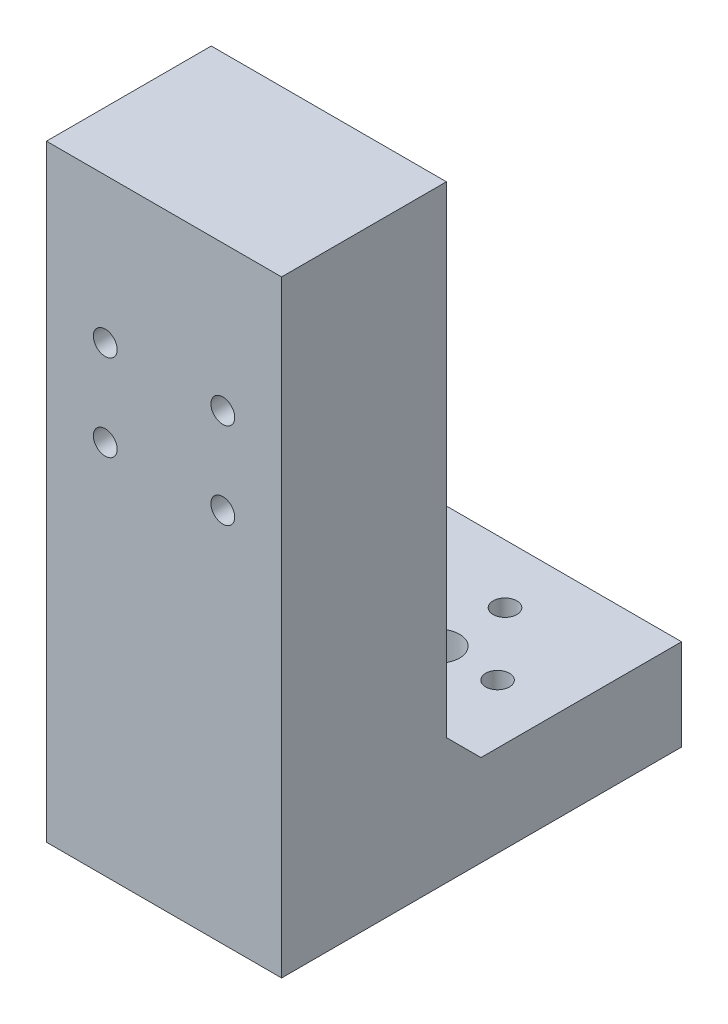
ISO-10303-21;
HEADER;
FILE_DESCRIPTION(('STEP AP214'),'2;1');
FILE_NAME('part.step','',(''),(''),'','','');
FILE_SCHEMA(('AUTOMOTIVE_DESIGN { 1 0 10303 214 1 1 1 1 }'));
ENDSEC;
DATA;
#1=APPLICATION_CONTEXT('core data for automotive mechanical design processes');
#2=APPLICATION_PROTOCOL_DEFINITION('international standard','automotive_design',2000,#1);
#3=PRODUCT_CONTEXT('',#1,'mechanical');
#4=PRODUCT('Part','Part','',(#3));
#5=PRODUCT_RELATED_PRODUCT_CATEGORY('part','',(#4));
#6=PRODUCT_DEFINITION_FORMATION('','',#4);
#7=PRODUCT_DEFINITION_CONTEXT('part definition',#1,'design');
#8=PRODUCT_DEFINITION('design','',#6,#7);
#9=PRODUCT_DEFINITION_SHAPE('','',#8);
#10=(LENGTH_UNIT() NAMED_UNIT(*) SI_UNIT(.MILLI.,.METRE.));
#11=(NAMED_UNIT(*) PLANE_ANGLE_UNIT() SI_UNIT($,.RADIAN.));
#12=(NAMED_UNIT(*) SI_UNIT($,.STERADIAN.) SOLID_ANGLE_UNIT());
#13=UNCERTAINTY_MEASURE_WITH_UNIT(LENGTH_MEASURE(1.E-05),#10,'distance_accuracy_value','');
#14=(GEOMETRIC_REPRESENTATION_CONTEXT(3) GLOBAL_UNCERTAINTY_ASSIGNED_CONTEXT((#13)) GLOBAL_UNIT_ASSIGNED_CONTEXT((#10,
#11,#12)) REPRESENTATION_CONTEXT('',''));
#15=CARTESIAN_POINT('',(0.,0.,0.));
#16=DIRECTION('',(0.,0.,1.));
#17=DIRECTION('',(1.,0.,0.));
#18=AXIS2_PLACEMENT_3D('',#15,#16,#17);
#19=CARTESIAN_POINT('',(-2.6024496124031,13.19,-18.1033410852713));
#20=DIRECTION('',(1.,0.,0.));
#21=DIRECTION('',(0.,0.,-1.));
#22=AXIS2_PLACEMENT_3D('',#19,#20,#21);
#23=PLANE('',#22);
#24=DIRECTION('',(0.,-1.,0.));
#25=VECTOR('',#24,1.);
#26=CARTESIAN_POINT('',(-2.60244961240309,0.,15.8966589147287));
#27=LINE('',#26,#25);
#28=CARTESIAN_POINT('',(-2.60244961240309,87.79,15.8966589147287));
#29=VERTEX_POINT('',#28);
#30=CARTESIAN_POINT('',(-2.60244961240309,18.19,15.8966589147287));
#31=VERTEX_POINT('',#30);
#32=EDGE_CURVE('E241',#29,#31,#27,.T.);
#33=ORIENTED_EDGE('',*,*,#32,.T.);
#34=DIRECTION('',(0.,0.707106781186548,0.707106781186548));
#35=VECTOR('',#34,1.);
#36=CARTESIAN_POINT('',(-2.60244961240309,13.19,10.8966589147287));
#37=LINE('',#36,#35);
#38=CARTESIAN_POINT('',(-2.60244961240309,13.19,10.8966589147287));
#39=VERTEX_POINT('',#38);
#40=EDGE_CURVE('E153',#39,#31,#37,.T.);
#41=ORIENTED_EDGE('',*,*,#40,.F.);
#42=DIRECTION('',(0.,0.,1.));
#43=VECTOR('',#42,1.);
#44=CARTESIAN_POINT('',(-2.6024496124031,13.19,-18.1033410852713));
#45=LINE('',#44,#43);
#46=CARTESIAN_POINT('',(-2.6024496124031,13.19,-18.1033410852713));
#47=VERTEX_POINT('',#46);
#48=EDGE_CURVE('E257',#47,#39,#45,.T.);
#49=ORIENTED_EDGE('',*,*,#48,.F.);
#50=DIRECTION('',(0.,-1.,0.));
#51=VECTOR('',#50,1.);
#52=CARTESIAN_POINT('',(-2.6024496124031,13.19,-18.1033410852713));
#53=LINE('',#52,#51);
#54=CARTESIAN_POINT('',(-2.6024496124031,0.,-18.1033410852713));
#55=VERTEX_POINT('',#54);
#56=EDGE_CURVE('E54',#47,#55,#53,.T.);
#57=ORIENTED_EDGE('',*,*,#56,.T.);
#58=DIRECTION('',(0.,0.,1.));
#59=VECTOR('',#58,1.);
#60=CARTESIAN_POINT('',(-2.6024496124031,0.,-18.1033410852713));
#61=LINE('',#60,#59);
#62=CARTESIAN_POINT('',(-2.60244961240309,0.,39.7266589147287));
#63=VERTEX_POINT('',#62);
#64=EDGE_CURVE('E256',#55,#63,#61,.T.);
#65=ORIENTED_EDGE('',*,*,#64,.T.);
#66=DIRECTION('',(0.,-1.,0.));
#67=VECTOR('',#66,1.);
#68=CARTESIAN_POINT('',(-2.60244961240309,0.,39.7266589147287));
#69=LINE('',#68,#67);
#70=CARTESIAN_POINT('',(-2.60244961240309,87.79,39.7266589147287));
#71=VERTEX_POINT('',#70);
#72=EDGE_CURVE('E226',#71,#63,#69,.T.);
#73=ORIENTED_EDGE('',*,*,#72,.F.);
#74=DIRECTION('',(0.,0.,-1.));
#75=VECTOR('',#74,1.);
#76=CARTESIAN_POINT('',(-2.60244961240309,87.79,39.7266589147287));
#77=LINE('',#76,#75);
#78=EDGE_CURVE('E240',#71,#29,#77,.T.);
#79=ORIENTED_EDGE('',*,*,#78,.T.);
#80=EDGE_LOOP('',(#33,#41,#49,#57,#65,#73,#79));
#81=FACE_BOUND('',#80,.T.);
#82=ADVANCED_FACE('F45',(#81),#23,.F.);
#83=CARTESIAN_POINT('',(31.3975503875969,13.19,-18.1033410852713));
#84=DIRECTION('',(-1.,0.,0.));
#85=DIRECTION('',(0.,0.,1.));
#86=AXIS2_PLACEMENT_3D('',#83,#84,#85);
#87=PLANE('',#86);
#88=DIRECTION('',(0.,0.,-1.));
#89=VECTOR('',#88,1.);
#90=CARTESIAN_POINT('',(31.3975503875969,13.19,-18.1033410852713));
#91=LINE('',#90,#89);
#92=CARTESIAN_POINT('',(31.3975503875969,13.19,10.8966589147287));
#93=VERTEX_POINT('',#92);
#94=CARTESIAN_POINT('',(31.3975503875969,13.19,-18.1033410852713));
#95=VERTEX_POINT('',#94);
#96=EDGE_CURVE('E265',#93,#95,#91,.T.);
#97=ORIENTED_EDGE('',*,*,#96,.F.);
#98=DIRECTION('',(0.,-0.707106781186548,-0.707106781186547));
#99=VECTOR('',#98,1.);
#100=CARTESIAN_POINT('',(31.3975503875969,18.19,15.8966589147287));
#101=LINE('',#100,#99);
#102=CARTESIAN_POINT('',(31.3975503875969,18.19,15.8966589147287));
#103=VERTEX_POINT('',#102);
#104=EDGE_CURVE('E131',#103,#93,#101,.T.);
#105=ORIENTED_EDGE('',*,*,#104,.F.);
#106=DIRECTION('',(0.,1.,0.));
#107=VECTOR('',#106,1.);
#108=CARTESIAN_POINT('',(31.3975503875969,0.,15.8966589147287));
#109=LINE('',#108,#107);
#110=CARTESIAN_POINT('',(31.3975503875969,87.79,15.8966589147287));
#111=VERTEX_POINT('',#110);
#112=EDGE_CURVE('E145',#103,#111,#109,.T.);
#113=ORIENTED_EDGE('',*,*,#112,.T.);
#114=DIRECTION('',(0.,0.,-1.));
#115=VECTOR('',#114,1.);
#116=CARTESIAN_POINT('',(31.3975503875969,87.79,39.7266589147287));
#117=LINE('',#116,#115);
#118=CARTESIAN_POINT('',(31.3975503875969,87.79,39.7266589147287));
#119=VERTEX_POINT('',#118);
#120=EDGE_CURVE('E252',#119,#111,#117,.T.);
#121=ORIENTED_EDGE('',*,*,#120,.F.);
#122=DIRECTION('',(0.,1.,0.));
#123=VECTOR('',#122,1.);
#124=CARTESIAN_POINT('',(31.3975503875969,0.,39.7266589147287));
#125=LINE('',#124,#123);
#126=CARTESIAN_POINT('',(31.3975503875969,0.,39.7266589147287));
#127=VERTEX_POINT('',#126);
#128=EDGE_CURVE('E234',#127,#119,#125,.T.);
#129=ORIENTED_EDGE('',*,*,#128,.F.);
#130=DIRECTION('',(0.,0.,-1.));
#131=VECTOR('',#130,1.);
#132=CARTESIAN_POINT('',(31.3975503875969,0.,-18.1033410852713));
#133=LINE('',#132,#131);
#134=CARTESIAN_POINT('',(31.3975503875969,0.,-18.1033410852713));
#135=VERTEX_POINT('',#134);
#136=EDGE_CURVE('E273',#127,#135,#133,.T.);
#137=ORIENTED_EDGE('',*,*,#136,.T.);
#138=DIRECTION('',(0.,-1.,0.));
#139=VECTOR('',#138,1.);
#140=CARTESIAN_POINT('',(31.3975503875969,13.19,-18.1033410852713));
#141=LINE('',#140,#139);
#142=EDGE_CURVE('E11',#95,#135,#141,.T.);
#143=ORIENTED_EDGE('',*,*,#142,.F.);
#144=EDGE_LOOP('',(#97,#105,#113,#121,#129,#137,#143));
#145=FACE_BOUND('',#144,.T.);
#146=ADVANCED_FACE('F318',(#145),#87,.F.);
#147=CARTESIAN_POINT('',(-2.6024496124031,13.19,-18.1033410852713));
#148=DIRECTION('',(0.,0.,1.));
#149=DIRECTION('',(1.,0.,0.));
#150=AXIS2_PLACEMENT_3D('',#147,#148,#149);
#151=PLANE('',#150);
#152=DIRECTION('',(-1.,0.,0.));
#153=VECTOR('',#152,1.);
#154=CARTESIAN_POINT('',(-2.6024496124031,0.,-18.1033410852713));
#155=LINE('',#154,#153);
#156=EDGE_CURVE('E262',#135,#55,#155,.T.);
#157=ORIENTED_EDGE('',*,*,#156,.T.);
#158=ORIENTED_EDGE('',*,*,#56,.F.);
#159=DIRECTION('',(-1.,0.,0.));
#160=VECTOR('',#159,1.);
#161=CARTESIAN_POINT('',(-2.6024496124031,13.19,-18.1033410852713));
#162=LINE('',#161,#160);
#163=EDGE_CURVE('E268',#95,#47,#162,.T.);
#164=ORIENTED_EDGE('',*,*,#163,.F.);
#165=ORIENTED_EDGE('',*,*,#142,.T.);
#166=EDGE_LOOP('',(#157,#158,#164,#165));
#167=FACE_BOUND('',#166,.T.);
#168=ADVANCED_FACE('F323',(#167),#151,.F.);
#169=CARTESIAN_POINT('',(0.,13.19,0.));
#170=DIRECTION('',(0.,1.,0.));
#171=DIRECTION('',(0.,0.,1.));
#172=AXIS2_PLACEMENT_3D('',#169,#170,#171);
#173=PLANE('',#172);
#174=DIRECTION('',(1.,0.,0.));
#175=VECTOR('',#174,1.);
#176=CARTESIAN_POINT('',(0.,13.19,10.8966589147287));
#177=LINE('',#176,#175);
#178=CARTESIAN_POINT('',(29.3975503875969,13.19,10.8966589147287));
#179=VERTEX_POINT('',#178);
#180=EDGE_CURVE('E138',#93,#179,#177,.F.);
#181=ORIENTED_EDGE('',*,*,#180,.F.);
#182=ORIENTED_EDGE('',*,*,#96,.T.);
#183=ORIENTED_EDGE('',*,*,#163,.T.);
#184=ORIENTED_EDGE('',*,*,#48,.T.);
#185=DIRECTION('',(1.,0.,0.));
#186=VECTOR('',#185,1.);
#187=CARTESIAN_POINT('',(0.,13.19,10.8966589147287));
#188=LINE('',#187,#186);
#189=CARTESIAN_POINT('',(-0.602449612403093,13.19,10.8966589147287));
#190=VERTEX_POINT('',#189);
#191=EDGE_CURVE('E169',#190,#39,#188,.F.);
#192=ORIENTED_EDGE('',*,*,#191,.F.);
#193=DIRECTION('',(0.,0.,1.));
#194=VECTOR('',#193,1.);
#195=CARTESIAN_POINT('',(-0.602449612403094,13.19,0.));
#196=LINE('',#195,#194);
#197=CARTESIAN_POINT('',(-0.602449612403093,13.19,15.8966589147287));
#198=VERTEX_POINT('',#197);
#199=EDGE_CURVE('E162',#190,#198,#196,.T.);
#200=ORIENTED_EDGE('',*,*,#199,.T.);
#201=DIRECTION('',(1.,0.,0.));
#202=VECTOR('',#201,1.);
#203=CARTESIAN_POINT('',(-2.60244961240309,13.19,15.8966589147287));
#204=LINE('',#203,#202);
#205=CARTESIAN_POINT('',(29.3975503875969,13.19,15.8966589147287));
#206=VERTEX_POINT('',#205);
#207=EDGE_CURVE('E261',#198,#206,#204,.T.);
#208=ORIENTED_EDGE('',*,*,#207,.T.);
#209=DIRECTION('',(0.,0.,-1.));
#210=VECTOR('',#209,1.);
#211=CARTESIAN_POINT('',(29.3975503875969,13.19,0.));
#212=LINE('',#211,#210);
#213=EDGE_CURVE('E62',#206,#179,#212,.T.);
#214=ORIENTED_EDGE('',*,*,#213,.T.);
#215=EDGE_LOOP('',(#181,#182,#183,#184,#192,#200,#208,#214));
#216=FACE_BOUND('',#215,.T.);
#217=CARTESIAN_POINT('',(22.8975503875969,13.19,0.));
#218=DIRECTION('',(0.,1.,0.));
#219=DIRECTION('',(0.,0.,1.));
#220=AXIS2_PLACEMENT_3D('',#217,#218,#219);
#221=CIRCLE('',#220,1.72);
#222=CARTESIAN_POINT('',(22.8975503875969,13.19,1.72));
#223=VERTEX_POINT('',#222);
#224=EDGE_CURVE('E173',#223,#223,#221,.T.);
#225=ORIENTED_EDGE('',*,*,#224,.F.);
#226=EDGE_LOOP('',(#225));
#227=FACE_BOUND('',#226,.T.);
#228=CARTESIAN_POINT('',(14.3690664970009,13.19,-9.60334108527133));
#229=DIRECTION('',(0.,1.,0.));
#230=DIRECTION('',(0.,0.,1.));
#231=AXIS2_PLACEMENT_3D('',#228,#229,#230);
#232=CIRCLE('',#231,1.72);
#233=CARTESIAN_POINT('',(14.3690664970009,13.19,-7.88334108527133));
#234=VERTEX_POINT('',#233);
#235=EDGE_CURVE('E178',#234,#234,#232,.T.);
#236=ORIENTED_EDGE('',*,*,#235,.F.);
#237=EDGE_LOOP('',(#236));
#238=FACE_BOUND('',#237,.T.);
#239=CARTESIAN_POINT('',(14.3690664970009,13.19,7.39665891472868));
#240=DIRECTION('',(0.,1.,0.));
#241=DIRECTION('',(0.,0.,1.));
#242=AXIS2_PLACEMENT_3D('',#239,#240,#241);
#243=CIRCLE('',#242,1.72);
#244=CARTESIAN_POINT('',(14.3690664970009,13.19,9.11665891472867));
#245=VERTEX_POINT('',#244);
#246=EDGE_CURVE('E182',#245,#245,#243,.T.);
#247=ORIENTED_EDGE('',*,*,#246,.F.);
#248=EDGE_LOOP('',(#247));
#249=FACE_BOUND('',#248,.T.);
#250=CARTESIAN_POINT('',(5.8975503875969,13.19,0.));
#251=DIRECTION('',(0.,1.,0.));
#252=DIRECTION('',(0.,0.,1.));
#253=AXIS2_PLACEMENT_3D('',#250,#251,#252);
#254=CIRCLE('',#253,1.72);
#255=CARTESIAN_POINT('',(5.8975503875969,13.19,1.72));
#256=VERTEX_POINT('',#255);
#257=EDGE_CURVE('E172',#256,#256,#254,.T.);
#258=ORIENTED_EDGE('',*,*,#257,.F.);
#259=EDGE_LOOP('',(#258));
#260=FACE_BOUND('',#259,.T.);
#261=CARTESIAN_POINT('',(14.3975503875969,13.19,0.));
#262=DIRECTION('',(0.,1.,0.));
#263=DIRECTION('',(0.,0.,1.));
#264=AXIS2_PLACEMENT_3D('',#261,#262,#263);
#265=CIRCLE('',#264,3.);
#266=CARTESIAN_POINT('',(14.3975503875969,13.19,3.));
#267=VERTEX_POINT('',#266);
#268=EDGE_CURVE('E221',#267,#267,#265,.T.);
#269=ORIENTED_EDGE('',*,*,#268,.F.);
#270=EDGE_LOOP('',(#269));
#271=FACE_BOUND('',#270,.T.);
#272=ADVANCED_FACE('F333',(#216,#227,#238,#249,#260,#271),#173,.T.);
#273=CARTESIAN_POINT('',(0.,0.,0.));
#274=DIRECTION('',(0.,1.,0.));
#275=DIRECTION('',(0.,0.,1.));
#276=AXIS2_PLACEMENT_3D('',#273,#274,#275);
#277=PLANE('',#276);
#278=ORIENTED_EDGE('',*,*,#156,.F.);
#279=ORIENTED_EDGE('',*,*,#136,.F.);
#280=DIRECTION('',(1.,0.,0.));
#281=VECTOR('',#280,1.);
#282=CARTESIAN_POINT('',(-2.60244961240309,0.,39.7266589147287));
#283=LINE('',#282,#281);
#284=EDGE_CURVE('E230',#63,#127,#283,.T.);
#285=ORIENTED_EDGE('',*,*,#284,.F.);
#286=ORIENTED_EDGE('',*,*,#64,.F.);
#287=EDGE_LOOP('',(#278,#279,#285,#286));
#288=FACE_BOUND('',#287,.T.);
#289=CARTESIAN_POINT('',(22.8975503875969,0.,0.));
#290=DIRECTION('',(0.,1.,0.));
#291=DIRECTION('',(0.,0.,1.));
#292=AXIS2_PLACEMENT_3D('',#289,#290,#291);
#293=CIRCLE('',#292,1.72);
#294=CARTESIAN_POINT('',(22.8975503875969,0.,1.72));
#295=VERTEX_POINT('',#294);
#296=EDGE_CURVE('E48',#295,#295,#293,.T.);
#297=ORIENTED_EDGE('',*,*,#296,.T.);
#298=EDGE_LOOP('',(#297));
#299=FACE_BOUND('',#298,.T.);
#300=CARTESIAN_POINT('',(14.3690664970009,0.,-9.60334108527133));
#301=DIRECTION('',(0.,1.,0.));
#302=DIRECTION('',(0.,0.,1.));
#303=AXIS2_PLACEMENT_3D('',#300,#301,#302);
#304=CIRCLE('',#303,1.72);
#305=CARTESIAN_POINT('',(14.3690664970009,0.,-7.88334108527133));
#306=VERTEX_POINT('',#305);
#307=EDGE_CURVE('E290',#306,#306,#304,.T.);
#308=ORIENTED_EDGE('',*,*,#307,.T.);
#309=EDGE_LOOP('',(#308));
#310=FACE_BOUND('',#309,.T.);
#311=CARTESIAN_POINT('',(14.3690664970009,0.,7.39665891472868));
#312=DIRECTION('',(0.,1.,0.));
#313=DIRECTION('',(0.,0.,1.));
#314=AXIS2_PLACEMENT_3D('',#311,#312,#313);
#315=CIRCLE('',#314,1.72);
#316=CARTESIAN_POINT('',(14.3690664970009,0.,9.11665891472867));
#317=VERTEX_POINT('',#316);
#318=EDGE_CURVE('E287',#317,#317,#315,.T.);
#319=ORIENTED_EDGE('',*,*,#318,.T.);
#320=EDGE_LOOP('',(#319));
#321=FACE_BOUND('',#320,.T.);
#322=CARTESIAN_POINT('',(5.8975503875969,0.,0.));
#323=DIRECTION('',(0.,1.,0.));
#324=DIRECTION('',(0.,0.,1.));
#325=AXIS2_PLACEMENT_3D('',#322,#323,#324);
#326=CIRCLE('',#325,1.72);
#327=CARTESIAN_POINT('',(5.8975503875969,0.,1.72));
#328=VERTEX_POINT('',#327);
#329=EDGE_CURVE('E177',#328,#328,#326,.T.);
#330=ORIENTED_EDGE('',*,*,#329,.T.);
#331=EDGE_LOOP('',(#330));
#332=FACE_BOUND('',#331,.T.);
#333=CARTESIAN_POINT('',(14.3975503875969,0.,0.));
#334=DIRECTION('',(0.,1.,0.));
#335=DIRECTION('',(0.,0.,1.));
#336=AXIS2_PLACEMENT_3D('',#333,#334,#335);
#337=CIRCLE('',#336,3.);
#338=CARTESIAN_POINT('',(14.3975503875969,0.,3.));
#339=VERTEX_POINT('',#338);
#340=EDGE_CURVE('E225',#339,#339,#337,.T.);
#341=ORIENTED_EDGE('',*,*,#340,.T.);
#342=EDGE_LOOP('',(#341));
#343=FACE_BOUND('',#342,.T.);
#344=ADVANCED_FACE('F299',(#288,#299,#310,#321,#332,#343),#277,.F.);
#345=CARTESIAN_POINT('',(0.,0.,15.8966589147287));
#346=DIRECTION('',(0.,0.,-1.));
#347=DIRECTION('',(-1.,0.,0.));
#348=AXIS2_PLACEMENT_3D('',#345,#346,#347);
#349=PLANE('',#348);
#350=DIRECTION('',(-1.,0.,0.));
#351=VECTOR('',#350,1.);
#352=CARTESIAN_POINT('',(0.,18.19,15.8966589147287));
#353=LINE('',#352,#351);
#354=CARTESIAN_POINT('',(29.3975503875969,18.19,15.8966589147287));
#355=VERTEX_POINT('',#354);
#356=EDGE_CURVE('E135',#355,#103,#353,.F.);
#357=ORIENTED_EDGE('',*,*,#356,.F.);
#358=DIRECTION('',(0.,-1.,0.));
#359=VECTOR('',#358,1.);
#360=CARTESIAN_POINT('',(29.3975503875969,0.,15.8966589147287));
#361=LINE('',#360,#359);
#362=EDGE_CURVE('E122',#355,#206,#361,.T.);
#363=ORIENTED_EDGE('',*,*,#362,.T.);
#364=ORIENTED_EDGE('',*,*,#207,.F.);
#365=DIRECTION('',(0.,1.,0.));
#366=VECTOR('',#365,1.);
#367=CARTESIAN_POINT('',(-0.602449612403093,0.,15.8966589147287));
#368=LINE('',#367,#366);
#369=CARTESIAN_POINT('',(-0.602449612403093,18.19,15.8966589147287));
#370=VERTEX_POINT('',#369);
#371=EDGE_CURVE('E156',#198,#370,#368,.T.);
#372=ORIENTED_EDGE('',*,*,#371,.T.);
#373=DIRECTION('',(-1.,0.,0.));
#374=VECTOR('',#373,1.);
#375=CARTESIAN_POINT('',(0.,18.19,15.8966589147287));
#376=LINE('',#375,#374);
#377=EDGE_CURVE('E166',#31,#370,#376,.F.);
#378=ORIENTED_EDGE('',*,*,#377,.F.);
#379=ORIENTED_EDGE('',*,*,#32,.F.);
#380=DIRECTION('',(-1.,0.,0.));
#381=VECTOR('',#380,1.);
#382=CARTESIAN_POINT('',(-2.60244961240309,87.79,15.8966589147287));
#383=LINE('',#382,#381);
#384=EDGE_CURVE('E231',#111,#29,#383,.T.);
#385=ORIENTED_EDGE('',*,*,#384,.F.);
#386=ORIENTED_EDGE('',*,*,#112,.F.);
#387=EDGE_LOOP('',(#357,#363,#364,#372,#378,#379,#385,#386));
#388=FACE_BOUND('',#387,.T.);
#389=CARTESIAN_POINT('',(22.8975503875969,66.7931954276484,15.8966589147287));
#390=DIRECTION('',(0.,0.,-1.));
#391=DIRECTION('',(-1.,0.,0.));
#392=AXIS2_PLACEMENT_3D('',#389,#390,#391);
#393=CIRCLE('',#392,1.72);
#394=CARTESIAN_POINT('',(21.1775503875969,66.7931954276484,15.8966589147287));
#395=VERTEX_POINT('',#394);
#396=EDGE_CURVE('E217',#395,#395,#393,.T.);
#397=ORIENTED_EDGE('',*,*,#396,.F.);
#398=EDGE_LOOP('',(#397));
#399=FACE_BOUND('',#398,.T.);
#400=CARTESIAN_POINT('',(5.89755038759691,54.3106393361163,15.8966589147287));
#401=DIRECTION('',(0.,0.,-1.));
#402=DIRECTION('',(-1.,0.,0.));
#403=AXIS2_PLACEMENT_3D('',#400,#401,#402);
#404=CIRCLE('',#403,1.72);
#405=CARTESIAN_POINT('',(4.1775503875969,54.3106393361163,15.8966589147287));
#406=VERTEX_POINT('',#405);
#407=EDGE_CURVE('E213',#406,#406,#404,.T.);
#408=ORIENTED_EDGE('',*,*,#407,.F.);
#409=EDGE_LOOP('',(#408));
#410=FACE_BOUND('',#409,.T.);
#411=CARTESIAN_POINT('',(22.8975503875969,54.3106393361163,15.8966589147287));
#412=DIRECTION('',(0.,0.,-1.));
#413=DIRECTION('',(-1.,0.,0.));
#414=AXIS2_PLACEMENT_3D('',#411,#412,#413);
#415=CIRCLE('',#414,1.72);
#416=CARTESIAN_POINT('',(21.1775503875969,54.3106393361163,15.8966589147287));
#417=VERTEX_POINT('',#416);
#418=EDGE_CURVE('E209',#417,#417,#415,.T.);
#419=ORIENTED_EDGE('',*,*,#418,.F.);
#420=EDGE_LOOP('',(#419));
#421=FACE_BOUND('',#420,.T.);
#422=CARTESIAN_POINT('',(5.89755038759691,66.7931954276484,15.8966589147287));
#423=DIRECTION('',(0.,0.,-1.));
#424=DIRECTION('',(-1.,0.,0.));
#425=AXIS2_PLACEMENT_3D('',#422,#423,#424);
#426=CIRCLE('',#425,1.72);
#427=CARTESIAN_POINT('',(4.17755038759691,66.7931954276484,15.8966589147287));
#428=VERTEX_POINT('',#427);
#429=EDGE_CURVE('E205',#428,#428,#426,.T.);
#430=ORIENTED_EDGE('',*,*,#429,.F.);
#431=EDGE_LOOP('',(#430));
#432=FACE_BOUND('',#431,.T.);
#433=ADVANCED_FACE('F142',(#388,#399,#410,#421,#432),#349,.T.);
#434=CARTESIAN_POINT('',(-2.60244961240309,87.79,39.7266589147287));
#435=DIRECTION('',(0.,-1.,0.));
#436=DIRECTION('',(0.,0.,-1.));
#437=AXIS2_PLACEMENT_3D('',#434,#435,#436);
#438=PLANE('',#437);
#439=ORIENTED_EDGE('',*,*,#384,.T.);
#440=ORIENTED_EDGE('',*,*,#78,.F.);
#441=DIRECTION('',(-1.,0.,0.));
#442=VECTOR('',#441,1.);
#443=CARTESIAN_POINT('',(-2.60244961240309,87.79,39.7266589147287));
#444=LINE('',#443,#442);
#445=EDGE_CURVE('E237',#119,#71,#444,.T.);
#446=ORIENTED_EDGE('',*,*,#445,.F.);
#447=ORIENTED_EDGE('',*,*,#120,.T.);
#448=EDGE_LOOP('',(#439,#440,#446,#447));
#449=FACE_BOUND('',#448,.T.);
#450=ADVANCED_FACE('F350',(#449),#438,.F.);
#451=CARTESIAN_POINT('',(0.,0.,39.7266589147287));
#452=DIRECTION('',(0.,0.,-1.));
#453=DIRECTION('',(-1.,0.,0.));
#454=AXIS2_PLACEMENT_3D('',#451,#452,#453);
#455=PLANE('',#454);
#456=ORIENTED_EDGE('',*,*,#128,.T.);
#457=ORIENTED_EDGE('',*,*,#445,.T.);
#458=ORIENTED_EDGE('',*,*,#72,.T.);
#459=ORIENTED_EDGE('',*,*,#284,.T.);
#460=EDGE_LOOP('',(#456,#457,#458,#459));
#461=FACE_BOUND('',#460,.T.);
#462=CARTESIAN_POINT('',(22.8975503875969,66.7931954276484,39.7266589147287));
#463=DIRECTION('',(0.,0.,1.));
#464=DIRECTION('',(1.,0.,0.));
#465=AXIS2_PLACEMENT_3D('',#462,#463,#464);
#466=CIRCLE('',#465,1.72);
#467=CARTESIAN_POINT('',(24.6175503875969,66.7931954276484,39.7266589147287));
#468=VERTEX_POINT('',#467);
#469=EDGE_CURVE('E194',#468,#468,#466,.T.);
#470=ORIENTED_EDGE('',*,*,#469,.F.);
#471=EDGE_LOOP('',(#470));
#472=FACE_BOUND('',#471,.T.);
#473=CARTESIAN_POINT('',(5.89755038759691,54.3106393361163,39.7266589147287));
#474=DIRECTION('',(0.,0.,1.));
#475=DIRECTION('',(1.,0.,0.));
#476=AXIS2_PLACEMENT_3D('',#473,#474,#475);
#477=CIRCLE('',#476,1.72);
#478=CARTESIAN_POINT('',(7.61755038759691,54.3106393361163,39.7266589147287));
#479=VERTEX_POINT('',#478);
#480=EDGE_CURVE('E193',#479,#479,#477,.T.);
#481=ORIENTED_EDGE('',*,*,#480,.F.);
#482=EDGE_LOOP('',(#481));
#483=FACE_BOUND('',#482,.T.);
#484=CARTESIAN_POINT('',(22.8975503875969,54.3106393361163,39.7266589147287));
#485=DIRECTION('',(0.,0.,1.));
#486=DIRECTION('',(1.,0.,0.));
#487=AXIS2_PLACEMENT_3D('',#484,#485,#486);
#488=CIRCLE('',#487,1.72);
#489=CARTESIAN_POINT('',(24.6175503875969,54.3106393361163,39.7266589147287));
#490=VERTEX_POINT('',#489);
#491=EDGE_CURVE('E189',#490,#490,#488,.T.);
#492=ORIENTED_EDGE('',*,*,#491,.F.);
#493=EDGE_LOOP('',(#492));
#494=FACE_BOUND('',#493,.T.);
#495=CARTESIAN_POINT('',(5.89755038759691,66.7931954276484,39.7266589147287));
#496=DIRECTION('',(0.,0.,1.));
#497=DIRECTION('',(1.,0.,0.));
#498=AXIS2_PLACEMENT_3D('',#495,#496,#497);
#499=CIRCLE('',#498,1.72);
#500=CARTESIAN_POINT('',(7.61755038759691,66.7931954276484,39.7266589147287));
#501=VERTEX_POINT('',#500);
#502=EDGE_CURVE('E198',#501,#501,#499,.T.);
#503=ORIENTED_EDGE('',*,*,#502,.F.);
#504=EDGE_LOOP('',(#503));
#505=FACE_BOUND('',#504,.T.);
#506=ADVANCED_FACE('F345',(#461,#472,#483,#494,#505),#455,.F.);
#507=CARTESIAN_POINT('',(14.3975503875969,-8.64,0.));
#508=DIRECTION('',(0.,1.,0.));
#509=DIRECTION('',(0.,0.,1.));
#510=AXIS2_PLACEMENT_3D('',#507,#508,#509);
#511=CYLINDRICAL_SURFACE('',#510,3.);
#512=CARTESIAN_POINT('',(14.3975503875969,13.19,3.));
#513=CARTESIAN_POINT('',(14.3975503875969,13.0526041666667,3.));
#514=CARTESIAN_POINT('',(14.3975503875969,12.9152083333333,3.));
#515=CARTESIAN_POINT('',(14.3975503875969,12.6404166666667,3.));
#516=CARTESIAN_POINT('',(14.3975503875969,12.5030208333333,3.));
#517=CARTESIAN_POINT('',(14.3975503875969,12.2282291666667,3.));
#518=CARTESIAN_POINT('',(14.3975503875969,12.0908333333333,3.));
#519=CARTESIAN_POINT('',(14.3975503875969,11.8160416666667,3.));
#520=CARTESIAN_POINT('',(14.3975503875969,11.6786458333333,3.));
#521=CARTESIAN_POINT('',(14.3975503875969,11.4038541666667,3.));
#522=CARTESIAN_POINT('',(14.3975503875969,11.2664583333333,3.));
#523=CARTESIAN_POINT('',(14.3975503875969,10.9916666666667,3.));
#524=CARTESIAN_POINT('',(14.3975503875969,10.8542708333333,3.));
#525=CARTESIAN_POINT('',(14.3975503875969,10.5794791666667,3.));
#526=CARTESIAN_POINT('',(14.3975503875969,10.4420833333333,3.));
#527=CARTESIAN_POINT('',(14.3975503875969,10.1672916666667,3.));
#528=CARTESIAN_POINT('',(14.3975503875969,10.0298958333333,3.));
#529=CARTESIAN_POINT('',(14.3975503875969,9.75510416666666,3.));
#530=CARTESIAN_POINT('',(14.3975503875969,9.61770833333333,3.));
#531=CARTESIAN_POINT('',(14.3975503875969,9.34291666666666,3.));
#532=CARTESIAN_POINT('',(14.3975503875969,9.20552083333333,3.));
#533=CARTESIAN_POINT('',(14.3975503875969,8.93072916666666,3.));
#534=CARTESIAN_POINT('',(14.3975503875969,8.79333333333333,3.));
#535=CARTESIAN_POINT('',(14.3975503875969,8.51854166666667,3.));
#536=CARTESIAN_POINT('',(14.3975503875969,8.38114583333333,3.));
#537=CARTESIAN_POINT('',(14.3975503875969,8.10635416666666,3.));
#538=CARTESIAN_POINT('',(14.3975503875969,7.96895833333333,3.));
#539=CARTESIAN_POINT('',(14.3975503875969,7.69416666666666,3.));
#540=CARTESIAN_POINT('',(14.3975503875969,7.55677083333333,3.));
#541=CARTESIAN_POINT('',(14.3975503875969,7.28197916666666,3.));
#542=CARTESIAN_POINT('',(14.3975503875969,7.14458333333333,3.));
#543=CARTESIAN_POINT('',(14.3975503875969,6.86979166666666,3.));
#544=CARTESIAN_POINT('',(14.3975503875969,6.73239583333333,3.));
#545=CARTESIAN_POINT('',(14.3975503875969,6.45760416666666,3.));
#546=CARTESIAN_POINT('',(14.3975503875969,6.32020833333333,3.));
#547=CARTESIAN_POINT('',(14.3975503875969,6.04541666666666,3.));
#548=CARTESIAN_POINT('',(14.3975503875969,5.90802083333333,3.));
#549=CARTESIAN_POINT('',(14.3975503875969,5.63322916666666,3.));
#550=CARTESIAN_POINT('',(14.3975503875969,5.49583333333333,3.));
#551=CARTESIAN_POINT('',(14.3975503875969,5.22104166666666,3.));
#552=CARTESIAN_POINT('',(14.3975503875969,5.08364583333333,3.));
#553=CARTESIAN_POINT('',(14.3975503875969,4.80885416666666,3.));
#554=CARTESIAN_POINT('',(14.3975503875969,4.67145833333333,3.));
#555=CARTESIAN_POINT('',(14.3975503875969,4.39666666666666,3.));
#556=CARTESIAN_POINT('',(14.3975503875969,4.25927083333333,3.));
#557=CARTESIAN_POINT('',(14.3975503875969,3.98447916666666,3.));
#558=CARTESIAN_POINT('',(14.3975503875969,3.84708333333333,3.));
#559=CARTESIAN_POINT('',(14.3975503875969,3.57229166666666,3.));
#560=CARTESIAN_POINT('',(14.3975503875969,3.43489583333333,3.));
#561=CARTESIAN_POINT('',(14.3975503875969,3.16010416666667,3.));
#562=CARTESIAN_POINT('',(14.3975503875969,3.02270833333333,3.));
#563=CARTESIAN_POINT('',(14.3975503875969,2.74791666666667,3.));
#564=CARTESIAN_POINT('',(14.3975503875969,2.61052083333333,3.));
#565=CARTESIAN_POINT('',(14.3975503875969,2.33572916666666,3.));
#566=CARTESIAN_POINT('',(14.3975503875969,2.19833333333333,3.));
#567=CARTESIAN_POINT('',(14.3975503875969,1.92354166666667,3.));
#568=CARTESIAN_POINT('',(14.3975503875969,1.78614583333333,3.));
#569=CARTESIAN_POINT('',(14.3975503875969,1.51135416666667,3.));
#570=CARTESIAN_POINT('',(14.3975503875969,1.37395833333333,3.));
#571=CARTESIAN_POINT('',(14.3975503875969,1.09916666666666,3.));
#572=CARTESIAN_POINT('',(14.3975503875969,0.961770833333332,3.));
#573=CARTESIAN_POINT('',(14.3975503875969,0.686979166666665,3.));
#574=CARTESIAN_POINT('',(14.3975503875969,0.549583333333331,3.));
#575=CARTESIAN_POINT('',(14.3975503875969,0.274791666666664,3.));
#576=CARTESIAN_POINT('',(14.3975503875969,0.137395833333331,3.));
#577=CARTESIAN_POINT('',(14.3975503875969,0.,3.));
#578=B_SPLINE_CURVE_WITH_KNOTS('',3,(#512,#513,#514,#515,#516,#517,#518,#519,#520,#521,#522,
#523,#524,#525,#526,#527,#528,#529,#530,#531,#532,#533,#534,#535,#536,#537,#538,#539,#540,#541,
#542,#543,#544,#545,#546,#547,#548,#549,#550,#551,#552,#553,#554,#555,#556,#557,#558,#559,#560,
#561,#562,#563,#564,#565,#566,#567,#568,#569,#570,#571,#572,#573,#574,#575,#576,#577),
.UNSPECIFIED.,.F.,.F.,(4,2,2,2,2,2,2,2,2,2,2,2,2,2,2,2,2,2,2,2,2,2,2,2,2,2,2,2,2,2,2,2,4),(0.,
0.412187500000001,0.824374999999999,1.2365625,1.64875,2.0609375,2.473125,2.8853125,3.2975,
3.7096875,4.121875,4.5340625,4.94625,5.3584375,5.770625,6.1828125,6.595,7.0071875,7.419375,
7.8315625,8.24375,8.6559375,9.068125,9.4803125,9.8925,10.3046875,10.716875,11.1290625,11.54125,
11.9534375,12.365625,12.7778125,13.19),.UNSPECIFIED.);
#579=EDGE_CURVE('BSEAM370',#267,#339,#578,.T.);
#580=ORIENTED_EDGE('',*,*,#268,.T.);
#581=ORIENTED_EDGE('',*,*,#340,.F.);
#582=ORIENTED_EDGE('',*,*,#579,.T.);
#583=ORIENTED_EDGE('',*,*,#579,.F.);
#584=EDGE_LOOP('',(#580,#582,#581,#583));
#585=FACE_BOUND('',#584,.T.);
#586=ADVANCED_FACE('F370',(#585),#511,.F.);
#587=CARTESIAN_POINT('',(5.89755038759691,66.7931954276484,7.89665891472867));
#588=DIRECTION('',(0.,0.,1.));
#589=DIRECTION('',(1.,0.,0.));
#590=AXIS2_PLACEMENT_3D('',#587,#588,#589);
#591=CYLINDRICAL_SURFACE('',#590,1.72);
#592=ORIENTED_EDGE('',*,*,#429,.T.);
#593=EDGE_LOOP('',(#592));
#594=FACE_BOUND('',#593,.T.);
#595=ORIENTED_EDGE('',*,*,#502,.T.);
#596=EDGE_LOOP('',(#595));
#597=FACE_BOUND('',#596,.T.);
#598=ADVANCED_FACE('F373',(#594,#597),#591,.F.);
#599=CARTESIAN_POINT('',(22.8975503875969,54.3106393361163,7.89665891472867));
#600=DIRECTION('',(0.,0.,1.));
#601=DIRECTION('',(1.,0.,0.));
#602=AXIS2_PLACEMENT_3D('',#599,#600,#601);
#603=CYLINDRICAL_SURFACE('',#602,1.72);
#604=ORIENTED_EDGE('',*,*,#418,.T.);
#605=EDGE_LOOP('',(#604));
#606=FACE_BOUND('',#605,.T.);
#607=ORIENTED_EDGE('',*,*,#491,.T.);
#608=EDGE_LOOP('',(#607));
#609=FACE_BOUND('',#608,.T.);
#610=ADVANCED_FACE('F377',(#606,#609),#603,.F.);
#611=CARTESIAN_POINT('',(5.89755038759691,54.3106393361163,7.89665891472867));
#612=DIRECTION('',(0.,0.,1.));
#613=DIRECTION('',(1.,0.,0.));
#614=AXIS2_PLACEMENT_3D('',#611,#612,#613);
#615=CYLINDRICAL_SURFACE('',#614,1.72);
#616=ORIENTED_EDGE('',*,*,#407,.T.);
#617=EDGE_LOOP('',(#616));
#618=FACE_BOUND('',#617,.T.);
#619=ORIENTED_EDGE('',*,*,#480,.T.);
#620=EDGE_LOOP('',(#619));
#621=FACE_BOUND('',#620,.T.);
#622=ADVANCED_FACE('F379',(#618,#621),#615,.F.);
#623=CARTESIAN_POINT('',(22.8975503875969,66.7931954276484,7.89665891472867));
#624=DIRECTION('',(0.,0.,1.));
#625=DIRECTION('',(1.,0.,0.));
#626=AXIS2_PLACEMENT_3D('',#623,#624,#625);
#627=CYLINDRICAL_SURFACE('',#626,1.72);
#628=ORIENTED_EDGE('',*,*,#396,.T.);
#629=EDGE_LOOP('',(#628));
#630=FACE_BOUND('',#629,.T.);
#631=ORIENTED_EDGE('',*,*,#469,.T.);
#632=EDGE_LOOP('',(#631));
#633=FACE_BOUND('',#632,.T.);
#634=ADVANCED_FACE('F382',(#630,#633),#627,.F.);
#635=CARTESIAN_POINT('',(5.8975503875969,-18.64,0.));
#636=DIRECTION('',(0.,1.,0.));
#637=DIRECTION('',(0.,0.,1.));
#638=AXIS2_PLACEMENT_3D('',#635,#636,#637);
#639=CYLINDRICAL_SURFACE('',#638,1.72);
#640=ORIENTED_EDGE('',*,*,#257,.T.);
#641=EDGE_LOOP('',(#640));
#642=FACE_BOUND('',#641,.T.);
#643=ORIENTED_EDGE('',*,*,#329,.F.);
#644=EDGE_LOOP('',(#643));
#645=FACE_BOUND('',#644,.T.);
#646=ADVANCED_FACE('F386',(#642,#645),#639,.F.);
#647=CARTESIAN_POINT('',(14.3690664970009,-18.64,7.39665891472868));
#648=DIRECTION('',(0.,1.,0.));
#649=DIRECTION('',(0.,0.,1.));
#650=AXIS2_PLACEMENT_3D('',#647,#648,#649);
#651=CYLINDRICAL_SURFACE('',#650,1.72);
#652=ORIENTED_EDGE('',*,*,#246,.T.);
#653=EDGE_LOOP('',(#652));
#654=FACE_BOUND('',#653,.T.);
#655=ORIENTED_EDGE('',*,*,#318,.F.);
#656=EDGE_LOOP('',(#655));
#657=FACE_BOUND('',#656,.T.);
#658=ADVANCED_FACE('F315',(#654,#657),#651,.F.);
#659=CARTESIAN_POINT('',(14.3690664970009,-18.64,-9.60334108527133));
#660=DIRECTION('',(0.,1.,0.));
#661=DIRECTION('',(0.,0.,1.));
#662=AXIS2_PLACEMENT_3D('',#659,#660,#661);
#663=CYLINDRICAL_SURFACE('',#662,1.72);
#664=ORIENTED_EDGE('',*,*,#235,.T.);
#665=EDGE_LOOP('',(#664));
#666=FACE_BOUND('',#665,.T.);
#667=ORIENTED_EDGE('',*,*,#307,.F.);
#668=EDGE_LOOP('',(#667));
#669=FACE_BOUND('',#668,.T.);
#670=ADVANCED_FACE('F304',(#666,#669),#663,.F.);
#671=CARTESIAN_POINT('',(22.8975503875969,-18.64,0.));
#672=DIRECTION('',(0.,1.,0.));
#673=DIRECTION('',(0.,0.,1.));
#674=AXIS2_PLACEMENT_3D('',#671,#672,#673);
#675=CYLINDRICAL_SURFACE('',#674,1.72);
#676=ORIENTED_EDGE('',*,*,#224,.T.);
#677=EDGE_LOOP('',(#676));
#678=FACE_BOUND('',#677,.T.);
#679=ORIENTED_EDGE('',*,*,#296,.F.);
#680=EDGE_LOOP('',(#679));
#681=FACE_BOUND('',#680,.T.);
#682=ADVANCED_FACE('F301',(#678,#681),#675,.F.);
#683=CARTESIAN_POINT('',(-0.602449612403094,13.19,10.8966589147287));
#684=DIRECTION('',(0.,-0.707106781186548,0.707106781186548));
#685=DIRECTION('',(0.,0.707106781186548,0.707106781186548));
#686=AXIS2_PLACEMENT_3D('',#683,#684,#685);
#687=PLANE('',#686);
#688=DIRECTION('',(0.,0.707106781186548,0.707106781186548));
#689=VECTOR('',#688,1.);
#690=CARTESIAN_POINT('',(-0.602449612403094,13.19,10.8966589147287));
#691=LINE('',#690,#689);
#692=EDGE_CURVE('E70',#190,#370,#691,.T.);
#693=ORIENTED_EDGE('',*,*,#692,.F.);
#694=ORIENTED_EDGE('',*,*,#191,.T.);
#695=ORIENTED_EDGE('',*,*,#40,.T.);
#696=ORIENTED_EDGE('',*,*,#377,.T.);
#697=EDGE_LOOP('',(#693,#694,#695,#696));
#698=FACE_BOUND('',#697,.T.);
#699=ADVANCED_FACE('F303',(#698),#687,.F.);
#700=CARTESIAN_POINT('',(-0.602449612403093,43.895,10.8116589147287));
#701=DIRECTION('',(-1.,0.,0.));
#702=DIRECTION('',(0.,0.,1.));
#703=AXIS2_PLACEMENT_3D('',#700,#701,#702);
#704=PLANE('',#703);
#705=ORIENTED_EDGE('',*,*,#199,.F.);
#706=ORIENTED_EDGE('',*,*,#692,.T.);
#707=ORIENTED_EDGE('',*,*,#371,.F.);
#708=EDGE_LOOP('',(#705,#706,#707));
#709=FACE_BOUND('',#708,.T.);
#710=ADVANCED_FACE('F312',(#709),#704,.F.);
#711=CARTESIAN_POINT('',(29.3975503875969,18.19,15.8966589147287));
#712=DIRECTION('',(0.,-0.707106781186547,0.707106781186548));
#713=DIRECTION('',(0.,-0.707106781186548,-0.707106781186547));
#714=AXIS2_PLACEMENT_3D('',#711,#712,#713);
#715=PLANE('',#714);
#716=ORIENTED_EDGE('',*,*,#104,.T.);
#717=ORIENTED_EDGE('',*,*,#180,.T.);
#718=DIRECTION('',(0.,-0.707106781186548,-0.707106781186547));
#719=VECTOR('',#718,1.);
#720=CARTESIAN_POINT('',(29.3975503875969,18.19,15.8966589147287));
#721=LINE('',#720,#719);
#722=EDGE_CURVE('E125',#355,#179,#721,.T.);
#723=ORIENTED_EDGE('',*,*,#722,.F.);
#724=ORIENTED_EDGE('',*,*,#356,.T.);
#725=EDGE_LOOP('',(#716,#717,#723,#724));
#726=FACE_BOUND('',#725,.T.);
#727=ADVANCED_FACE('F134',(#726),#715,.F.);
#728=CARTESIAN_POINT('',(29.3975503875969,43.895,10.8116589147287));
#729=DIRECTION('',(1.,0.,0.));
#730=DIRECTION('',(0.,0.,-1.));
#731=AXIS2_PLACEMENT_3D('',#728,#729,#730);
#732=PLANE('',#731);
#733=ORIENTED_EDGE('',*,*,#213,.F.);
#734=ORIENTED_EDGE('',*,*,#362,.F.);
#735=ORIENTED_EDGE('',*,*,#722,.T.);
#736=EDGE_LOOP('',(#733,#734,#735));
#737=FACE_BOUND('',#736,.T.);
#738=ADVANCED_FACE('F124',(#737),#732,.F.);
#739=CLOSED_SHELL('',(#82,#146,#168,#272,#344,#433,#450,#506,#586,#598,#610,#622,#634,#646,#658,
#670,#682,#699,#710,#727,#738));
#740=MANIFOLD_SOLID_BREP('B2',#739);
#741=ADVANCED_BREP_SHAPE_REPRESENTATION('',(#18,#740),#14);
#742=SHAPE_DEFINITION_REPRESENTATION(#9,#741);
ENDSEC;
END-ISO-10303-21;
